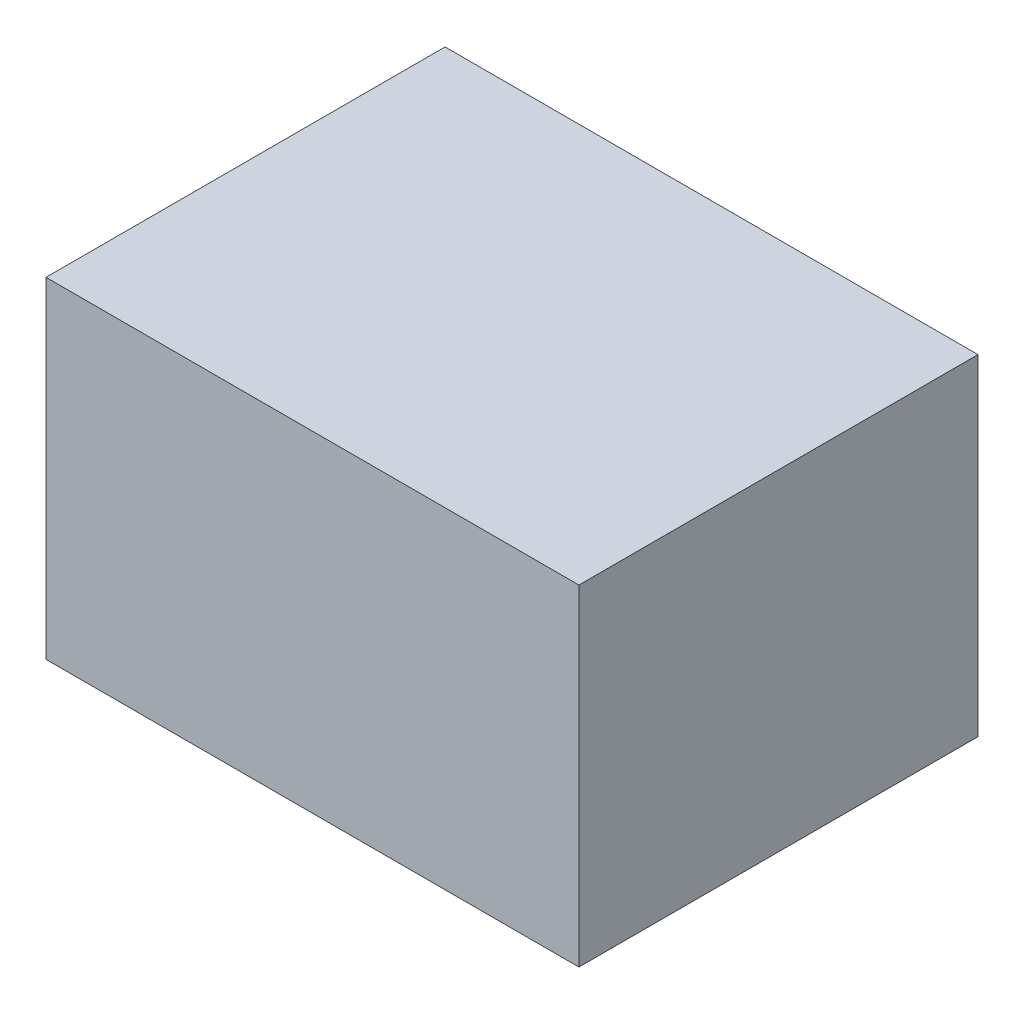
ISO-10303-21;
HEADER;
FILE_DESCRIPTION(('STEP AP214'),'2;1');
FILE_NAME('part.step','',(''),(''),'','','');
FILE_SCHEMA(('AUTOMOTIVE_DESIGN { 1 0 10303 214 1 1 1 1 }'));
ENDSEC;
DATA;
#1=APPLICATION_CONTEXT('core data for automotive mechanical design processes');
#2=APPLICATION_PROTOCOL_DEFINITION('international standard','automotive_design',2000,#1);
#3=PRODUCT_CONTEXT('',#1,'mechanical');
#4=PRODUCT('Part','Part','',(#3));
#5=PRODUCT_RELATED_PRODUCT_CATEGORY('part','',(#4));
#6=PRODUCT_DEFINITION_FORMATION('','',#4);
#7=PRODUCT_DEFINITION_CONTEXT('part definition',#1,'design');
#8=PRODUCT_DEFINITION('design','',#6,#7);
#9=PRODUCT_DEFINITION_SHAPE('','',#8);
#10=(LENGTH_UNIT() NAMED_UNIT(*) SI_UNIT(.MILLI.,.METRE.));
#11=(NAMED_UNIT(*) PLANE_ANGLE_UNIT() SI_UNIT($,.RADIAN.));
#12=(NAMED_UNIT(*) SI_UNIT($,.STERADIAN.) SOLID_ANGLE_UNIT());
#13=UNCERTAINTY_MEASURE_WITH_UNIT(LENGTH_MEASURE(1.E-05),#10,'distance_accuracy_value','');
#14=(GEOMETRIC_REPRESENTATION_CONTEXT(3) GLOBAL_UNCERTAINTY_ASSIGNED_CONTEXT((#13)) GLOBAL_UNIT_ASSIGNED_CONTEXT((#10,
#11,#12)) REPRESENTATION_CONTEXT('',''));
#15=CARTESIAN_POINT('',(0.,0.,0.));
#16=DIRECTION('',(0.,0.,1.));
#17=DIRECTION('',(1.,0.,0.));
#18=AXIS2_PLACEMENT_3D('',#15,#16,#17);
#19=CARTESIAN_POINT('',(0.,0.,15.8));
#20=DIRECTION('',(1.,0.,0.));
#21=DIRECTION('',(0.,0.,-1.));
#22=AXIS2_PLACEMENT_3D('',#19,#20,#21);
#23=PLANE('',#22);
#24=DIRECTION('',(0.,-1.,0.));
#25=VECTOR('',#24,1.);
#26=CARTESIAN_POINT('',(0.,0.,0.));
#27=LINE('',#26,#25);
#28=CARTESIAN_POINT('',(0.,13.1,0.));
#29=VERTEX_POINT('',#28);
#30=CARTESIAN_POINT('',(0.,0.,0.));
#31=VERTEX_POINT('',#30);
#32=EDGE_CURVE('E107',#29,#31,#27,.T.);
#33=ORIENTED_EDGE('',*,*,#32,.T.);
#34=DIRECTION('',(0.,0.,-1.));
#35=VECTOR('',#34,1.);
#36=CARTESIAN_POINT('',(0.,0.,15.8));
#37=LINE('',#36,#35);
#38=CARTESIAN_POINT('',(0.,0.,15.8));
#39=VERTEX_POINT('',#38);
#40=EDGE_CURVE('E11',#39,#31,#37,.T.);
#41=ORIENTED_EDGE('',*,*,#40,.F.);
#42=DIRECTION('',(0.,-1.,0.));
#43=VECTOR('',#42,1.);
#44=CARTESIAN_POINT('',(0.,0.,15.8));
#45=LINE('',#44,#43);
#46=CARTESIAN_POINT('',(0.,13.1,15.8));
#47=VERTEX_POINT('',#46);
#48=EDGE_CURVE('E91',#47,#39,#45,.T.);
#49=ORIENTED_EDGE('',*,*,#48,.F.);
#50=DIRECTION('',(0.,0.,-1.));
#51=VECTOR('',#50,1.);
#52=CARTESIAN_POINT('',(0.,13.1,15.8));
#53=LINE('',#52,#51);
#54=EDGE_CURVE('E103',#47,#29,#53,.T.);
#55=ORIENTED_EDGE('',*,*,#54,.T.);
#56=EDGE_LOOP('',(#33,#41,#49,#55));
#57=FACE_BOUND('',#56,.T.);
#58=ADVANCED_FACE('F39',(#57),#23,.F.);
#59=CARTESIAN_POINT('',(0.,0.,15.8));
#60=DIRECTION('',(0.,1.,0.));
#61=DIRECTION('',(0.,0.,1.));
#62=AXIS2_PLACEMENT_3D('',#59,#60,#61);
#63=PLANE('',#62);
#64=DIRECTION('',(1.,0.,0.));
#65=VECTOR('',#64,1.);
#66=CARTESIAN_POINT('',(0.,0.,0.));
#67=LINE('',#66,#65);
#68=CARTESIAN_POINT('',(21.1,0.,0.));
#69=VERTEX_POINT('',#68);
#70=EDGE_CURVE('E96',#31,#69,#67,.T.);
#71=ORIENTED_EDGE('',*,*,#70,.T.);
#72=DIRECTION('',(0.,0.,-1.));
#73=VECTOR('',#72,1.);
#74=CARTESIAN_POINT('',(21.1,0.,15.8));
#75=LINE('',#74,#73);
#76=CARTESIAN_POINT('',(21.1,0.,15.8));
#77=VERTEX_POINT('',#76);
#78=EDGE_CURVE('E48',#77,#69,#75,.T.);
#79=ORIENTED_EDGE('',*,*,#78,.F.);
#80=DIRECTION('',(1.,0.,0.));
#81=VECTOR('',#80,1.);
#82=CARTESIAN_POINT('',(0.,0.,15.8));
#83=LINE('',#82,#81);
#84=EDGE_CURVE('E86',#39,#77,#83,.T.);
#85=ORIENTED_EDGE('',*,*,#84,.F.);
#86=ORIENTED_EDGE('',*,*,#40,.T.);
#87=EDGE_LOOP('',(#71,#79,#85,#86));
#88=FACE_BOUND('',#87,.T.);
#89=ADVANCED_FACE('F95',(#88),#63,.F.);
#90=CARTESIAN_POINT('',(21.1,0.,15.8));
#91=DIRECTION('',(-1.,0.,0.));
#92=DIRECTION('',(0.,0.,1.));
#93=AXIS2_PLACEMENT_3D('',#90,#91,#92);
#94=PLANE('',#93);
#95=DIRECTION('',(0.,1.,0.));
#96=VECTOR('',#95,1.);
#97=CARTESIAN_POINT('',(21.1,0.,0.));
#98=LINE('',#97,#96);
#99=CARTESIAN_POINT('',(21.1,13.1,0.));
#100=VERTEX_POINT('',#99);
#101=EDGE_CURVE('E73',#69,#100,#98,.T.);
#102=ORIENTED_EDGE('',*,*,#101,.T.);
#103=DIRECTION('',(0.,0.,-1.));
#104=VECTOR('',#103,1.);
#105=CARTESIAN_POINT('',(21.1,13.1,15.8));
#106=LINE('',#105,#104);
#107=CARTESIAN_POINT('',(21.1,13.1,15.8));
#108=VERTEX_POINT('',#107);
#109=EDGE_CURVE('E98',#108,#100,#106,.T.);
#110=ORIENTED_EDGE('',*,*,#109,.F.);
#111=DIRECTION('',(0.,1.,0.));
#112=VECTOR('',#111,1.);
#113=CARTESIAN_POINT('',(21.1,0.,15.8));
#114=LINE('',#113,#112);
#115=EDGE_CURVE('E89',#77,#108,#114,.T.);
#116=ORIENTED_EDGE('',*,*,#115,.F.);
#117=ORIENTED_EDGE('',*,*,#78,.T.);
#118=EDGE_LOOP('',(#102,#110,#116,#117));
#119=FACE_BOUND('',#118,.T.);
#120=ADVANCED_FACE('F99',(#119),#94,.F.);
#121=CARTESIAN_POINT('',(0.,13.1,15.8));
#122=DIRECTION('',(0.,-1.,0.));
#123=DIRECTION('',(1.,0.,0.));
#124=AXIS2_PLACEMENT_3D('',#121,#122,#123);
#125=PLANE('',#124);
#126=DIRECTION('',(-1.,0.,0.));
#127=VECTOR('',#126,1.);
#128=CARTESIAN_POINT('',(0.,13.1,0.));
#129=LINE('',#128,#127);
#130=EDGE_CURVE('E79',#100,#29,#129,.T.);
#131=ORIENTED_EDGE('',*,*,#130,.T.);
#132=ORIENTED_EDGE('',*,*,#54,.F.);
#133=DIRECTION('',(-1.,0.,0.));
#134=VECTOR('',#133,1.);
#135=CARTESIAN_POINT('',(0.,13.1,15.8));
#136=LINE('',#135,#134);
#137=EDGE_CURVE('E56',#108,#47,#136,.T.);
#138=ORIENTED_EDGE('',*,*,#137,.F.);
#139=ORIENTED_EDGE('',*,*,#109,.T.);
#140=EDGE_LOOP('',(#131,#132,#138,#139));
#141=FACE_BOUND('',#140,.T.);
#142=ADVANCED_FACE('F120',(#141),#125,.F.);
#143=CARTESIAN_POINT('',(0.,0.,15.8));
#144=DIRECTION('',(0.,0.,-1.));
#145=DIRECTION('',(-1.,0.,0.));
#146=AXIS2_PLACEMENT_3D('',#143,#144,#145);
#147=PLANE('',#146);
#148=ORIENTED_EDGE('',*,*,#48,.T.);
#149=ORIENTED_EDGE('',*,*,#84,.T.);
#150=ORIENTED_EDGE('',*,*,#115,.T.);
#151=ORIENTED_EDGE('',*,*,#137,.T.);
#152=EDGE_LOOP('',(#148,#149,#150,#151));
#153=FACE_BOUND('',#152,.T.);
#154=ADVANCED_FACE('F87',(#153),#147,.F.);
#155=CARTESIAN_POINT('',(0.,0.,0.));
#156=DIRECTION('',(0.,0.,-1.));
#157=DIRECTION('',(-1.,0.,0.));
#158=AXIS2_PLACEMENT_3D('',#155,#156,#157);
#159=PLANE('',#158);
#160=ORIENTED_EDGE('',*,*,#32,.F.);
#161=ORIENTED_EDGE('',*,*,#130,.F.);
#162=ORIENTED_EDGE('',*,*,#101,.F.);
#163=ORIENTED_EDGE('',*,*,#70,.F.);
#164=EDGE_LOOP('',(#160,#161,#162,#163));
#165=FACE_BOUND('',#164,.T.);
#166=ADVANCED_FACE('F123',(#165),#159,.T.);
#167=CLOSED_SHELL('',(#58,#89,#120,#142,#154,#166));
#168=MANIFOLD_SOLID_BREP('B2',#167);
#169=ADVANCED_BREP_SHAPE_REPRESENTATION('',(#18,#168),#14);
#170=SHAPE_DEFINITION_REPRESENTATION(#9,#169);
ENDSEC;
END-ISO-10303-21;
